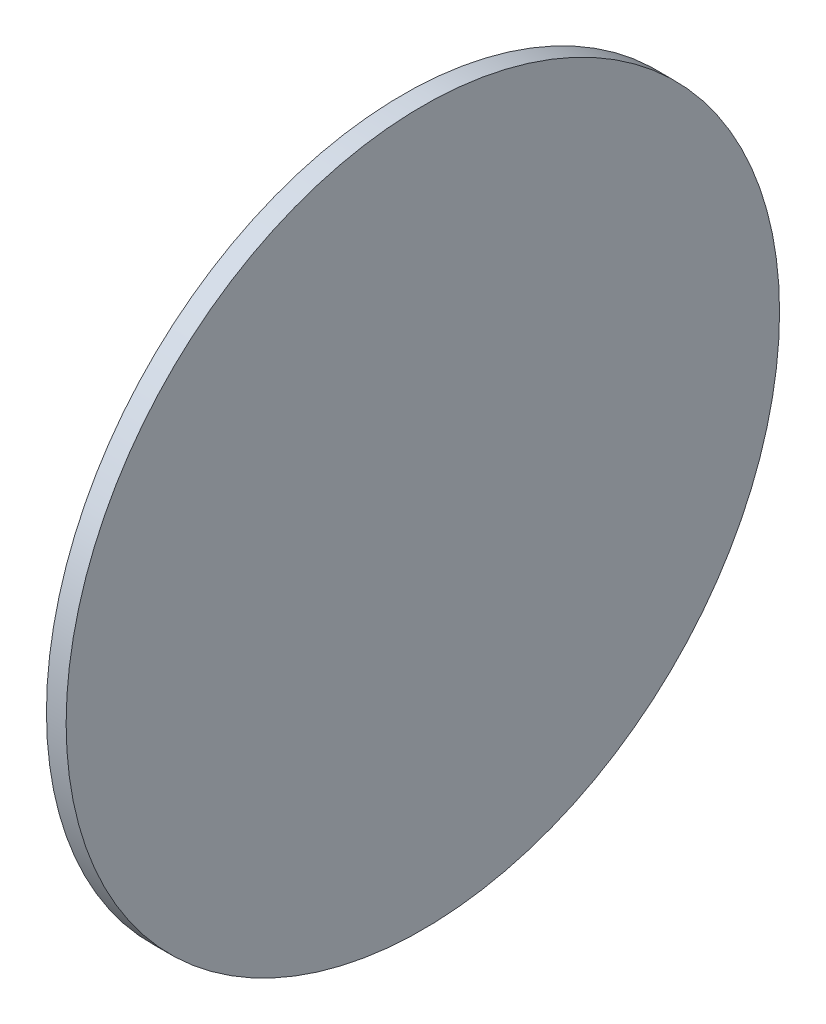
ISO-10303-21;
HEADER;
FILE_DESCRIPTION(('STEP AP214'),'2;1');
FILE_NAME('part.step','',(''),(''),'','','');
FILE_SCHEMA(('AUTOMOTIVE_DESIGN { 1 0 10303 214 1 1 1 1 }'));
ENDSEC;
DATA;
#1=APPLICATION_CONTEXT('core data for automotive mechanical design processes');
#2=APPLICATION_PROTOCOL_DEFINITION('international standard','automotive_design',2000,#1);
#3=PRODUCT_CONTEXT('',#1,'mechanical');
#4=PRODUCT('Part','Part','',(#3));
#5=PRODUCT_RELATED_PRODUCT_CATEGORY('part','',(#4));
#6=PRODUCT_DEFINITION_FORMATION('','',#4);
#7=PRODUCT_DEFINITION_CONTEXT('part definition',#1,'design');
#8=PRODUCT_DEFINITION('design','',#6,#7);
#9=PRODUCT_DEFINITION_SHAPE('','',#8);
#10=(LENGTH_UNIT() NAMED_UNIT(*) SI_UNIT(.MILLI.,.METRE.));
#11=(NAMED_UNIT(*) PLANE_ANGLE_UNIT() SI_UNIT($,.RADIAN.));
#12=(NAMED_UNIT(*) SI_UNIT($,.STERADIAN.) SOLID_ANGLE_UNIT());
#13=UNCERTAINTY_MEASURE_WITH_UNIT(LENGTH_MEASURE(1.E-05),#10,'distance_accuracy_value','');
#14=(GEOMETRIC_REPRESENTATION_CONTEXT(3) GLOBAL_UNCERTAINTY_ASSIGNED_CONTEXT((#13)) GLOBAL_UNIT_ASSIGNED_CONTEXT((#10,
#11,#12)) REPRESENTATION_CONTEXT('',''));
#15=CARTESIAN_POINT('',(0.,0.,0.));
#16=DIRECTION('',(0.,0.,1.));
#17=DIRECTION('',(1.,0.,0.));
#18=AXIS2_PLACEMENT_3D('',#15,#16,#17);
#19=CARTESIAN_POINT('',(4.,0.,0.));
#20=DIRECTION('',(-1.,0.,0.));
#21=DIRECTION('',(0.,0.,1.));
#22=AXIS2_PLACEMENT_3D('',#19,#20,#21);
#23=CYLINDRICAL_SURFACE('',#22,72.5);
#24=CARTESIAN_POINT('',(4.,0.,0.));
#25=DIRECTION('',(1.,0.,0.));
#26=DIRECTION('',(0.,0.,-1.));
#27=AXIS2_PLACEMENT_3D('',#24,#25,#26);
#28=CIRCLE('',#27,72.5);
#29=CARTESIAN_POINT('',(4.,0.,-72.5));
#30=VERTEX_POINT('',#29);
#31=EDGE_CURVE('E10',#30,#30,#28,.T.);
#32=ORIENTED_EDGE('',*,*,#31,.F.);
#33=EDGE_LOOP('',(#32));
#34=FACE_BOUND('',#33,.T.);
#35=CARTESIAN_POINT('',(0.,0.,0.));
#36=DIRECTION('',(1.,0.,0.));
#37=DIRECTION('',(0.,0.,-1.));
#38=AXIS2_PLACEMENT_3D('',#35,#36,#37);
#39=CIRCLE('',#38,72.5);
#40=CARTESIAN_POINT('',(0.,0.,-72.5));
#41=VERTEX_POINT('',#40);
#42=EDGE_CURVE('E34',#41,#41,#39,.T.);
#43=ORIENTED_EDGE('',*,*,#42,.T.);
#44=EDGE_LOOP('',(#43));
#45=FACE_BOUND('',#44,.T.);
#46=ADVANCED_FACE('F31',(#34,#45),#23,.T.);
#47=CARTESIAN_POINT('',(4.,0.,0.));
#48=DIRECTION('',(1.,0.,0.));
#49=DIRECTION('',(0.,0.,-1.));
#50=AXIS2_PLACEMENT_3D('',#47,#48,#49);
#51=PLANE('',#50);
#52=ORIENTED_EDGE('',*,*,#31,.T.);
#53=EDGE_LOOP('',(#52));
#54=FACE_BOUND('',#53,.T.);
#55=ADVANCED_FACE('F46',(#54),#51,.T.);
#56=CARTESIAN_POINT('',(0.,0.,0.));
#57=DIRECTION('',(1.,0.,0.));
#58=DIRECTION('',(0.,0.,-1.));
#59=AXIS2_PLACEMENT_3D('',#56,#57,#58);
#60=PLANE('',#59);
#61=ORIENTED_EDGE('',*,*,#42,.F.);
#62=EDGE_LOOP('',(#61));
#63=FACE_BOUND('',#62,.T.);
#64=ADVANCED_FACE('F44',(#63),#60,.F.);
#65=CLOSED_SHELL('',(#46,#55,#64));
#66=MANIFOLD_SOLID_BREP('B2',#65);
#67=ADVANCED_BREP_SHAPE_REPRESENTATION('',(#18,#66),#14);
#68=SHAPE_DEFINITION_REPRESENTATION(#9,#67);
ENDSEC;
END-ISO-10303-21;
